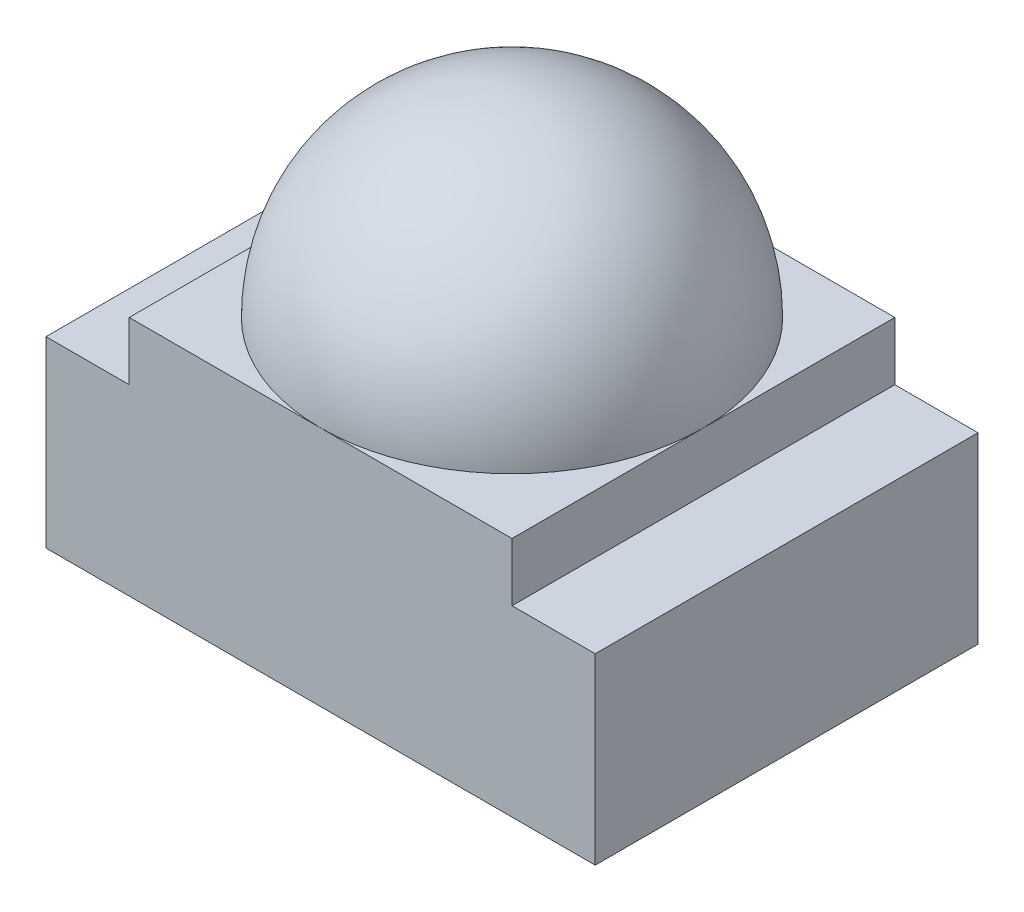
ISO-10303-21;
HEADER;
FILE_DESCRIPTION(('STEP AP214'),'2;1');
FILE_NAME('part.step','',(''),(''),'','','');
FILE_SCHEMA(('AUTOMOTIVE_DESIGN { 1 0 10303 214 1 1 1 1 }'));
ENDSEC;
DATA;
#1=APPLICATION_CONTEXT('core data for automotive mechanical design processes');
#2=APPLICATION_PROTOCOL_DEFINITION('international standard','automotive_design',2000,#1);
#3=PRODUCT_CONTEXT('',#1,'mechanical');
#4=PRODUCT('Part','Part','',(#3));
#5=PRODUCT_RELATED_PRODUCT_CATEGORY('part','',(#4));
#6=PRODUCT_DEFINITION_FORMATION('','',#4);
#7=PRODUCT_DEFINITION_CONTEXT('part definition',#1,'design');
#8=PRODUCT_DEFINITION('design','',#6,#7);
#9=PRODUCT_DEFINITION_SHAPE('','',#8);
#10=(LENGTH_UNIT() NAMED_UNIT(*) SI_UNIT(.MILLI.,.METRE.));
#11=(NAMED_UNIT(*) PLANE_ANGLE_UNIT() SI_UNIT($,.RADIAN.));
#12=(NAMED_UNIT(*) SI_UNIT($,.STERADIAN.) SOLID_ANGLE_UNIT());
#13=UNCERTAINTY_MEASURE_WITH_UNIT(LENGTH_MEASURE(1.E-05),#10,'distance_accuracy_value','');
#14=(GEOMETRIC_REPRESENTATION_CONTEXT(3) GLOBAL_UNCERTAINTY_ASSIGNED_CONTEXT((#13)) GLOBAL_UNIT_ASSIGNED_CONTEXT((#10,
#11,#12)) REPRESENTATION_CONTEXT('',''));
#15=CARTESIAN_POINT('',(0.,0.,0.));
#16=DIRECTION('',(0.,0.,1.));
#17=DIRECTION('',(1.,0.,0.));
#18=AXIS2_PLACEMENT_3D('',#15,#16,#17);
#19=CARTESIAN_POINT('',(0.,4.5,0.));
#20=DIRECTION('',(0.,1.,0.));
#21=DIRECTION('',(0.,0.,1.));
#22=AXIS2_PLACEMENT_3D('',#19,#20,#21);
#23=PLANE('',#22);
#24=DIRECTION('',(1.,0.,0.));
#25=VECTOR('',#24,1.);
#26=CARTESIAN_POINT('',(-11.5,4.5,11.5));
#27=LINE('',#26,#25);
#28=CARTESIAN_POINT('',(-11.5,4.5,11.5));
#29=VERTEX_POINT('',#28);
#30=CARTESIAN_POINT('',(0.,4.5,11.5));
#31=VERTEX_POINT('',#30);
#32=EDGE_CURVE('E142',#29,#31,#27,.T.);
#33=ORIENTED_EDGE('',*,*,#32,.T.);
#34=CARTESIAN_POINT('',(0.,4.5,0.));
#35=DIRECTION('',(0.,1.,0.));
#36=DIRECTION('',(0.,0.,1.));
#37=AXIS2_PLACEMENT_3D('',#34,#35,#36);
#38=CIRCLE('',#37,11.5);
#39=CARTESIAN_POINT('',(-11.5,4.5,0.));
#40=VERTEX_POINT('',#39);
#41=EDGE_CURVE('E11',#31,#40,#38,.F.);
#42=ORIENTED_EDGE('',*,*,#41,.T.);
#43=DIRECTION('',(0.,0.,1.));
#44=VECTOR('',#43,1.);
#45=CARTESIAN_POINT('',(-11.5,4.5,-11.5));
#46=LINE('',#45,#44);
#47=EDGE_CURVE('E138',#40,#29,#46,.T.);
#48=ORIENTED_EDGE('',*,*,#47,.T.);
#49=EDGE_LOOP('',(#33,#42,#48));
#50=FACE_BOUND('',#49,.T.);
#51=ADVANCED_FACE('F33',(#50),#23,.T.);
#52=CARTESIAN_POINT('',(-11.5,4.5,-11.5));
#53=VERTEX_POINT('',#52);
#54=EDGE_CURVE('E139',#53,#40,#46,.T.);
#55=ORIENTED_EDGE('',*,*,#54,.T.);
#56=CARTESIAN_POINT('',(0.,4.5,-11.5));
#57=VERTEX_POINT('',#56);
#58=EDGE_CURVE('E41',#40,#57,#38,.F.);
#59=ORIENTED_EDGE('',*,*,#58,.T.);
#60=DIRECTION('',(-1.,0.,0.));
#61=VECTOR('',#60,1.);
#62=CARTESIAN_POINT('',(-11.5,4.5,-11.5));
#63=LINE('',#62,#61);
#64=EDGE_CURVE('E135',#57,#53,#63,.T.);
#65=ORIENTED_EDGE('',*,*,#64,.T.);
#66=EDGE_LOOP('',(#55,#59,#65));
#67=FACE_BOUND('',#66,.T.);
#68=ADVANCED_FACE('F218',(#67),#23,.T.);
#69=CARTESIAN_POINT('',(11.5,4.5,-11.5));
#70=VERTEX_POINT('',#69);
#71=EDGE_CURVE('E120',#70,#57,#63,.T.);
#72=ORIENTED_EDGE('',*,*,#71,.T.);
#73=CARTESIAN_POINT('',(11.5,4.5,0.));
#74=VERTEX_POINT('',#73);
#75=EDGE_CURVE('E42',#57,#74,#38,.F.);
#76=ORIENTED_EDGE('',*,*,#75,.T.);
#77=DIRECTION('',(0.,0.,-1.));
#78=VECTOR('',#77,1.);
#79=CARTESIAN_POINT('',(11.5,4.5,-11.5));
#80=LINE('',#79,#78);
#81=EDGE_CURVE('E118',#74,#70,#80,.T.);
#82=ORIENTED_EDGE('',*,*,#81,.T.);
#83=EDGE_LOOP('',(#72,#76,#82));
#84=FACE_BOUND('',#83,.T.);
#85=ADVANCED_FACE('F117',(#84),#23,.T.);
#86=CARTESIAN_POINT('',(0.,1.,0.));
#87=DIRECTION('',(0.,1.,0.));
#88=DIRECTION('',(0.,0.,1.));
#89=AXIS2_PLACEMENT_3D('',#86,#87,#88);
#90=PLANE('',#89);
#91=DIRECTION('',(0.,0.,-1.));
#92=VECTOR('',#91,1.);
#93=CARTESIAN_POINT('',(11.5,1.,-11.5));
#94=LINE('',#93,#92);
#95=CARTESIAN_POINT('',(11.5,1.,11.5));
#96=VERTEX_POINT('',#95);
#97=CARTESIAN_POINT('',(11.5,1.,-11.5));
#98=VERTEX_POINT('',#97);
#99=EDGE_CURVE('E55',#96,#98,#94,.T.);
#100=ORIENTED_EDGE('',*,*,#99,.F.);
#101=DIRECTION('',(1.,0.,0.));
#102=VECTOR('',#101,1.);
#103=CARTESIAN_POINT('',(-16.5,1.,11.5));
#104=LINE('',#103,#102);
#105=CARTESIAN_POINT('',(16.5,1.,11.5));
#106=VERTEX_POINT('',#105);
#107=EDGE_CURVE('E166',#96,#106,#104,.T.);
#108=ORIENTED_EDGE('',*,*,#107,.T.);
#109=DIRECTION('',(0.,0.,-1.));
#110=VECTOR('',#109,1.);
#111=CARTESIAN_POINT('',(16.5,1.,-11.5));
#112=LINE('',#111,#110);
#113=CARTESIAN_POINT('',(16.5,1.,-11.5));
#114=VERTEX_POINT('',#113);
#115=EDGE_CURVE('E157',#106,#114,#112,.T.);
#116=ORIENTED_EDGE('',*,*,#115,.T.);
#117=DIRECTION('',(-1.,0.,0.));
#118=VECTOR('',#117,1.);
#119=CARTESIAN_POINT('',(-16.5,1.,-11.5));
#120=LINE('',#119,#118);
#121=EDGE_CURVE('E161',#114,#98,#120,.T.);
#122=ORIENTED_EDGE('',*,*,#121,.T.);
#123=EDGE_LOOP('',(#100,#108,#116,#122));
#124=FACE_BOUND('',#123,.T.);
#125=ADVANCED_FACE('F195',(#124),#90,.T.);
#126=CARTESIAN_POINT('',(16.5,-10.,-11.5));
#127=DIRECTION('',(1.,0.,0.));
#128=DIRECTION('',(0.,0.,-1.));
#129=AXIS2_PLACEMENT_3D('',#126,#127,#128);
#130=PLANE('',#129);
#131=DIRECTION('',(0.,1.,0.));
#132=VECTOR('',#131,1.);
#133=CARTESIAN_POINT('',(16.5,-10.,-11.5));
#134=LINE('',#133,#132);
#135=CARTESIAN_POINT('',(16.5,-10.,-11.5));
#136=VERTEX_POINT('',#135);
#137=EDGE_CURVE('E181',#136,#114,#134,.T.);
#138=ORIENTED_EDGE('',*,*,#137,.T.);
#139=ORIENTED_EDGE('',*,*,#115,.F.);
#140=DIRECTION('',(0.,1.,0.));
#141=VECTOR('',#140,1.);
#142=CARTESIAN_POINT('',(16.5,-10.,11.5));
#143=LINE('',#142,#141);
#144=CARTESIAN_POINT('',(16.5,-10.,11.5));
#145=VERTEX_POINT('',#144);
#146=EDGE_CURVE('E121',#145,#106,#143,.T.);
#147=ORIENTED_EDGE('',*,*,#146,.F.);
#148=DIRECTION('',(0.,0.,-1.));
#149=VECTOR('',#148,1.);
#150=CARTESIAN_POINT('',(16.5,-10.,-11.5));
#151=LINE('',#150,#149);
#152=EDGE_CURVE('E169',#145,#136,#151,.T.);
#153=ORIENTED_EDGE('',*,*,#152,.T.);
#154=EDGE_LOOP('',(#138,#139,#147,#153));
#155=FACE_BOUND('',#154,.T.);
#156=ADVANCED_FACE('F35',(#155),#130,.T.);
#157=CARTESIAN_POINT('',(-16.5,-10.,11.5));
#158=DIRECTION('',(0.,0.,1.));
#159=DIRECTION('',(1.,0.,0.));
#160=AXIS2_PLACEMENT_3D('',#157,#158,#159);
#161=PLANE('',#160);
#162=ORIENTED_EDGE('',*,*,#146,.T.);
#163=ORIENTED_EDGE('',*,*,#107,.F.);
#164=DIRECTION('',(0.,-1.,0.));
#165=VECTOR('',#164,1.);
#166=CARTESIAN_POINT('',(11.5,4.5,11.5));
#167=LINE('',#166,#165);
#168=CARTESIAN_POINT('',(11.5,4.5,11.5));
#169=VERTEX_POINT('',#168);
#170=EDGE_CURVE('E145',#169,#96,#167,.T.);
#171=ORIENTED_EDGE('',*,*,#170,.F.);
#172=EDGE_CURVE('E133',#31,#169,#27,.T.);
#173=ORIENTED_EDGE('',*,*,#172,.F.);
#174=ORIENTED_EDGE('',*,*,#32,.F.);
#175=DIRECTION('',(0.,-1.,0.));
#176=VECTOR('',#175,1.);
#177=CARTESIAN_POINT('',(-11.5,4.5,11.5));
#178=LINE('',#177,#176);
#179=CARTESIAN_POINT('',(-11.5,1.,11.5));
#180=VERTEX_POINT('',#179);
#181=EDGE_CURVE('E150',#29,#180,#178,.T.);
#182=ORIENTED_EDGE('',*,*,#181,.T.);
#183=CARTESIAN_POINT('',(-16.5,1.,11.5));
#184=VERTEX_POINT('',#183);
#185=EDGE_CURVE('E167',#184,#180,#104,.T.);
#186=ORIENTED_EDGE('',*,*,#185,.F.);
#187=DIRECTION('',(0.,1.,0.));
#188=VECTOR('',#187,1.);
#189=CARTESIAN_POINT('',(-16.5,-10.,11.5));
#190=LINE('',#189,#188);
#191=CARTESIAN_POINT('',(-16.5,-10.,11.5));
#192=VERTEX_POINT('',#191);
#193=EDGE_CURVE('E184',#192,#184,#190,.T.);
#194=ORIENTED_EDGE('',*,*,#193,.F.);
#195=DIRECTION('',(1.,0.,0.));
#196=VECTOR('',#195,1.);
#197=CARTESIAN_POINT('',(-16.5,-10.,11.5));
#198=LINE('',#197,#196);
#199=EDGE_CURVE('E178',#192,#145,#198,.T.);
#200=ORIENTED_EDGE('',*,*,#199,.T.);
#201=EDGE_LOOP('',(#162,#163,#171,#173,#174,#182,#186,#194,#200));
#202=FACE_BOUND('',#201,.T.);
#203=ADVANCED_FACE('F197',(#202),#161,.T.);
#204=CARTESIAN_POINT('',(-16.5,-10.,-11.5));
#205=DIRECTION('',(-1.,0.,0.));
#206=DIRECTION('',(0.,0.,1.));
#207=AXIS2_PLACEMENT_3D('',#204,#205,#206);
#208=PLANE('',#207);
#209=ORIENTED_EDGE('',*,*,#193,.T.);
#210=DIRECTION('',(0.,0.,1.));
#211=VECTOR('',#210,1.);
#212=CARTESIAN_POINT('',(-16.5,1.,-11.5));
#213=LINE('',#212,#211);
#214=CARTESIAN_POINT('',(-16.5,1.,-11.5));
#215=VERTEX_POINT('',#214);
#216=EDGE_CURVE('E163',#215,#184,#213,.T.);
#217=ORIENTED_EDGE('',*,*,#216,.F.);
#218=DIRECTION('',(0.,1.,0.));
#219=VECTOR('',#218,1.);
#220=CARTESIAN_POINT('',(-16.5,-10.,-11.5));
#221=LINE('',#220,#219);
#222=CARTESIAN_POINT('',(-16.5,-10.,-11.5));
#223=VERTEX_POINT('',#222);
#224=EDGE_CURVE('E186',#223,#215,#221,.T.);
#225=ORIENTED_EDGE('',*,*,#224,.F.);
#226=DIRECTION('',(0.,0.,1.));
#227=VECTOR('',#226,1.);
#228=CARTESIAN_POINT('',(-16.5,-10.,-11.5));
#229=LINE('',#228,#227);
#230=EDGE_CURVE('E175',#223,#192,#229,.T.);
#231=ORIENTED_EDGE('',*,*,#230,.T.);
#232=EDGE_LOOP('',(#209,#217,#225,#231));
#233=FACE_BOUND('',#232,.T.);
#234=ADVANCED_FACE('F206',(#233),#208,.T.);
#235=CARTESIAN_POINT('',(-16.5,-10.,-11.5));
#236=DIRECTION('',(0.,0.,-1.));
#237=DIRECTION('',(-1.,0.,0.));
#238=AXIS2_PLACEMENT_3D('',#235,#236,#237);
#239=PLANE('',#238);
#240=ORIENTED_EDGE('',*,*,#224,.T.);
#241=CARTESIAN_POINT('',(-11.5,1.,-11.5));
#242=VERTEX_POINT('',#241);
#243=EDGE_CURVE('E160',#242,#215,#120,.T.);
#244=ORIENTED_EDGE('',*,*,#243,.F.);
#245=DIRECTION('',(0.,-1.,0.));
#246=VECTOR('',#245,1.);
#247=CARTESIAN_POINT('',(-11.5,4.5,-11.5));
#248=LINE('',#247,#246);
#249=EDGE_CURVE('E153',#53,#242,#248,.T.);
#250=ORIENTED_EDGE('',*,*,#249,.F.);
#251=ORIENTED_EDGE('',*,*,#64,.F.);
#252=ORIENTED_EDGE('',*,*,#71,.F.);
#253=DIRECTION('',(0.,-1.,0.));
#254=VECTOR('',#253,1.);
#255=CARTESIAN_POINT('',(11.5,4.5,-11.5));
#256=LINE('',#255,#254);
#257=EDGE_CURVE('E129',#70,#98,#256,.T.);
#258=ORIENTED_EDGE('',*,*,#257,.T.);
#259=ORIENTED_EDGE('',*,*,#121,.F.);
#260=ORIENTED_EDGE('',*,*,#137,.F.);
#261=DIRECTION('',(-1.,0.,0.));
#262=VECTOR('',#261,1.);
#263=CARTESIAN_POINT('',(-16.5,-10.,-11.5));
#264=LINE('',#263,#262);
#265=EDGE_CURVE('E172',#136,#223,#264,.T.);
#266=ORIENTED_EDGE('',*,*,#265,.T.);
#267=EDGE_LOOP('',(#240,#244,#250,#251,#252,#258,#259,#260,#266));
#268=FACE_BOUND('',#267,.T.);
#269=ADVANCED_FACE('F194',(#268),#239,.T.);
#270=CARTESIAN_POINT('',(0.,-10.,0.));
#271=DIRECTION('',(0.,1.,0.));
#272=DIRECTION('',(0.,0.,1.));
#273=AXIS2_PLACEMENT_3D('',#270,#271,#272);
#274=PLANE('',#273);
#275=ORIENTED_EDGE('',*,*,#152,.F.);
#276=ORIENTED_EDGE('',*,*,#199,.F.);
#277=ORIENTED_EDGE('',*,*,#230,.F.);
#278=ORIENTED_EDGE('',*,*,#265,.F.);
#279=EDGE_LOOP('',(#275,#276,#277,#278));
#280=FACE_BOUND('',#279,.T.);
#281=ADVANCED_FACE('F200',(#280),#274,.F.);
#282=DIRECTION('',(0.,0.,1.));
#283=VECTOR('',#282,1.);
#284=CARTESIAN_POINT('',(-11.5,1.,-11.5));
#285=LINE('',#284,#283);
#286=EDGE_CURVE('E130',#242,#180,#285,.T.);
#287=ORIENTED_EDGE('',*,*,#286,.F.);
#288=ORIENTED_EDGE('',*,*,#243,.T.);
#289=ORIENTED_EDGE('',*,*,#216,.T.);
#290=ORIENTED_EDGE('',*,*,#185,.T.);
#291=EDGE_LOOP('',(#287,#288,#289,#290));
#292=FACE_BOUND('',#291,.T.);
#293=ADVANCED_FACE('F209',(#292),#90,.T.);
#294=CARTESIAN_POINT('',(11.5,4.5,-11.5));
#295=DIRECTION('',(-1.,0.,0.));
#296=DIRECTION('',(0.,0.,1.));
#297=AXIS2_PLACEMENT_3D('',#294,#295,#296);
#298=PLANE('',#297);
#299=ORIENTED_EDGE('',*,*,#99,.T.);
#300=ORIENTED_EDGE('',*,*,#257,.F.);
#301=ORIENTED_EDGE('',*,*,#81,.F.);
#302=EDGE_CURVE('E127',#169,#74,#80,.T.);
#303=ORIENTED_EDGE('',*,*,#302,.F.);
#304=ORIENTED_EDGE('',*,*,#170,.T.);
#305=EDGE_LOOP('',(#299,#300,#301,#303,#304));
#306=FACE_BOUND('',#305,.T.);
#307=ADVANCED_FACE('F125',(#306),#298,.F.);
#308=CARTESIAN_POINT('',(-11.5,4.5,-11.5));
#309=DIRECTION('',(1.,0.,0.));
#310=DIRECTION('',(0.,0.,-1.));
#311=AXIS2_PLACEMENT_3D('',#308,#309,#310);
#312=PLANE('',#311);
#313=ORIENTED_EDGE('',*,*,#286,.T.);
#314=ORIENTED_EDGE('',*,*,#181,.F.);
#315=ORIENTED_EDGE('',*,*,#47,.F.);
#316=ORIENTED_EDGE('',*,*,#54,.F.);
#317=ORIENTED_EDGE('',*,*,#249,.T.);
#318=EDGE_LOOP('',(#313,#314,#315,#316,#317));
#319=FACE_BOUND('',#318,.T.);
#320=ADVANCED_FACE('F214',(#319),#312,.F.);
#321=ORIENTED_EDGE('',*,*,#302,.T.);
#322=CARTESIAN_POINT('',(0.,4.5,0.));
#323=DIRECTION('',(0.,1.,0.));
#324=DIRECTION('',(0.,0.,1.));
#325=AXIS2_PLACEMENT_3D('',#322,#323,#324);
#326=CIRCLE('',#325,11.5);
#327=EDGE_CURVE('E106',#31,#74,#326,.T.);
#328=ORIENTED_EDGE('',*,*,#327,.F.);
#329=ORIENTED_EDGE('',*,*,#172,.T.);
#330=EDGE_LOOP('',(#321,#328,#329));
#331=FACE_BOUND('',#330,.T.);
#332=ADVANCED_FACE('F132',(#331),#23,.T.);
#333=CARTESIAN_POINT('',(0.,4.5,0.));
#334=DIRECTION('',(0.,1.,0.));
#335=DIRECTION('',(1.,0.,0.));
#336=AXIS2_PLACEMENT_3D('',#333,#334,#335);
#337=SPHERICAL_SURFACE('',#336,11.5);
#338=ORIENTED_EDGE('',*,*,#327,.T.);
#339=ORIENTED_EDGE('',*,*,#75,.F.);
#340=ORIENTED_EDGE('',*,*,#58,.F.);
#341=ORIENTED_EDGE('',*,*,#41,.F.);
#342=EDGE_LOOP('',(#338,#339,#340,#341));
#343=FACE_BOUND('',#342,.T.);
#344=ADVANCED_FACE('F108',(#343),#337,.T.);
#345=CLOSED_SHELL('',(#51,#68,#85,#125,#156,#203,#234,#269,#281,#293,#307,#320,#332,#344));
#346=MANIFOLD_SOLID_BREP('B2',#345);
#347=ADVANCED_BREP_SHAPE_REPRESENTATION('',(#18,#346),#14);
#348=SHAPE_DEFINITION_REPRESENTATION(#9,#347);
ENDSEC;
END-ISO-10303-21;
